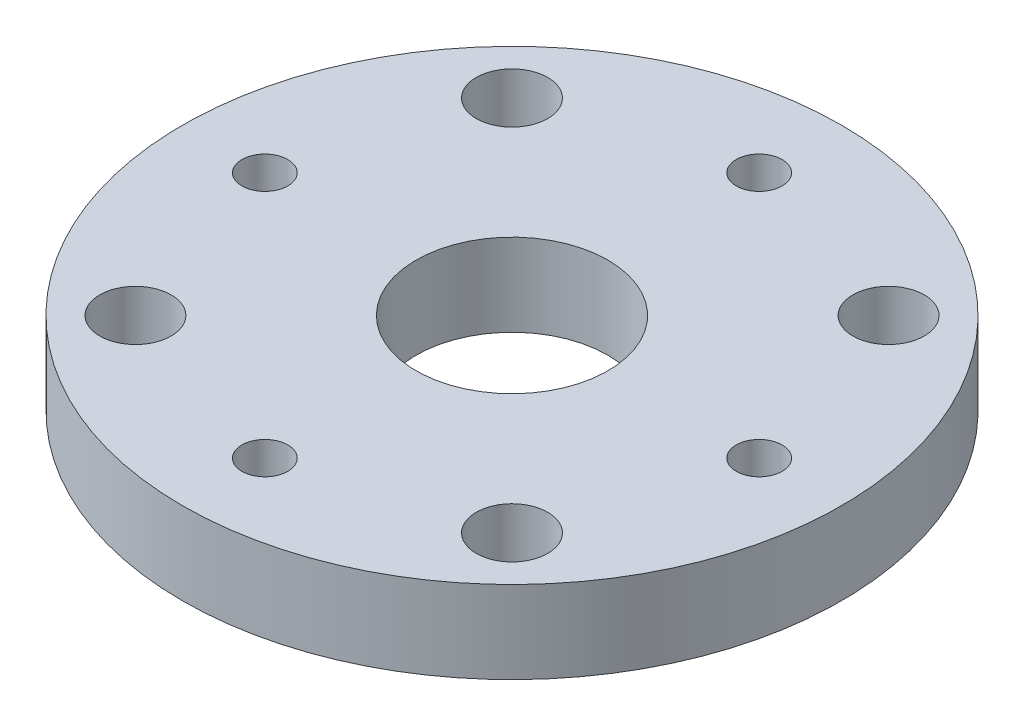
ISO-10303-21;
HEADER;
FILE_DESCRIPTION(('STEP AP214'),'2;1');
FILE_NAME('part.step','',(''),(''),'','','');
FILE_SCHEMA(('AUTOMOTIVE_DESIGN { 1 0 10303 214 1 1 1 1 }'));
ENDSEC;
DATA;
#1=APPLICATION_CONTEXT('core data for automotive mechanical design processes');
#2=APPLICATION_PROTOCOL_DEFINITION('international standard','automotive_design',2000,#1);
#3=PRODUCT_CONTEXT('',#1,'mechanical');
#4=PRODUCT('Part','Part','',(#3));
#5=PRODUCT_RELATED_PRODUCT_CATEGORY('part','',(#4));
#6=PRODUCT_DEFINITION_FORMATION('','',#4);
#7=PRODUCT_DEFINITION_CONTEXT('part definition',#1,'design');
#8=PRODUCT_DEFINITION('design','',#6,#7);
#9=PRODUCT_DEFINITION_SHAPE('','',#8);
#10=(LENGTH_UNIT() NAMED_UNIT(*) SI_UNIT(.MILLI.,.METRE.));
#11=(NAMED_UNIT(*) PLANE_ANGLE_UNIT() SI_UNIT($,.RADIAN.));
#12=(NAMED_UNIT(*) SI_UNIT($,.STERADIAN.) SOLID_ANGLE_UNIT());
#13=UNCERTAINTY_MEASURE_WITH_UNIT(LENGTH_MEASURE(1.E-05),#10,'distance_accuracy_value','');
#14=(GEOMETRIC_REPRESENTATION_CONTEXT(3) GLOBAL_UNCERTAINTY_ASSIGNED_CONTEXT((#13)) GLOBAL_UNIT_ASSIGNED_CONTEXT((#10,
#11,#12)) REPRESENTATION_CONTEXT('',''));
#15=CARTESIAN_POINT('',(0.,0.,0.));
#16=DIRECTION('',(0.,0.,1.));
#17=DIRECTION('',(1.,0.,0.));
#18=AXIS2_PLACEMENT_3D('',#15,#16,#17);
#19=CARTESIAN_POINT('',(34.2805367519242,15.,-34.2805367519234));
#20=DIRECTION('',(0.,-1.,0.));
#21=DIRECTION('',(0.,0.,-1.));
#22=AXIS2_PLACEMENT_3D('',#19,#20,#21);
#23=CYLINDRICAL_SURFACE('',#22,2.74999999999969);
#24=CARTESIAN_POINT('',(34.2805367519242,0.,-34.2805367519234));
#25=DIRECTION('',(0.,-1.,0.));
#26=DIRECTION('',(0.,0.,-1.));
#27=AXIS2_PLACEMENT_3D('',#24,#25,#26);
#28=CIRCLE('',#27,2.74999999999969);
#29=CARTESIAN_POINT('',(34.2805367519242,0.,-37.0305367519231));
#30=VERTEX_POINT('',#29);
#31=EDGE_CURVE('E82',#30,#30,#28,.T.);
#32=ORIENTED_EDGE('',*,*,#31,.T.);
#33=EDGE_LOOP('',(#32));
#34=FACE_BOUND('',#33,.T.);
#35=CARTESIAN_POINT('',(34.2805367519242,5.,-34.2805367519234));
#36=DIRECTION('',(0.,1.,0.));
#37=DIRECTION('',(0.,0.,1.));
#38=AXIS2_PLACEMENT_3D('',#35,#36,#37);
#39=CIRCLE('',#38,2.74999999999969);
#40=CARTESIAN_POINT('',(34.2805367519242,5.,-31.5305367519237));
#41=VERTEX_POINT('',#40);
#42=EDGE_CURVE('E40',#41,#41,#39,.F.);
#43=ORIENTED_EDGE('',*,*,#42,.F.);
#44=EDGE_LOOP('',(#43));
#45=FACE_BOUND('',#44,.T.);
#46=ADVANCED_FACE('F36',(#34,#45),#23,.F.);
#47=CARTESIAN_POINT('',(-34.2805367519234,15.,-34.2805367519243));
#48=DIRECTION('',(0.,-1.,0.));
#49=DIRECTION('',(0.,0.,-1.));
#50=AXIS2_PLACEMENT_3D('',#47,#48,#49);
#51=CYLINDRICAL_SURFACE('',#50,2.74999999999999);
#52=CARTESIAN_POINT('',(-34.2805367519234,0.,-34.2805367519243));
#53=DIRECTION('',(0.,-1.,0.));
#54=DIRECTION('',(0.,0.,-1.));
#55=AXIS2_PLACEMENT_3D('',#52,#53,#54);
#56=CIRCLE('',#55,2.74999999999999);
#57=CARTESIAN_POINT('',(-34.2805367519234,0.,-37.0305367519242));
#58=VERTEX_POINT('',#57);
#59=EDGE_CURVE('E79',#58,#58,#56,.T.);
#60=ORIENTED_EDGE('',*,*,#59,.T.);
#61=EDGE_LOOP('',(#60));
#62=FACE_BOUND('',#61,.T.);
#63=CARTESIAN_POINT('',(-34.2805367519234,5.,-34.2805367519243));
#64=DIRECTION('',(0.,1.,0.));
#65=DIRECTION('',(0.,0.,1.));
#66=AXIS2_PLACEMENT_3D('',#63,#64,#65);
#67=CIRCLE('',#66,2.74999999999999);
#68=CARTESIAN_POINT('',(-34.2805367519234,5.,-31.5305367519243));
#69=VERTEX_POINT('',#68);
#70=EDGE_CURVE('E61',#69,#69,#67,.F.);
#71=ORIENTED_EDGE('',*,*,#70,.F.);
#72=EDGE_LOOP('',(#71));
#73=FACE_BOUND('',#72,.T.);
#74=ADVANCED_FACE('F131',(#62,#73),#51,.F.);
#75=CARTESIAN_POINT('',(-34.2805367519242,15.,34.2805367519234));
#76=DIRECTION('',(0.,-1.,0.));
#77=DIRECTION('',(0.,0.,-1.));
#78=AXIS2_PLACEMENT_3D('',#75,#76,#77);
#79=CYLINDRICAL_SURFACE('',#78,2.75);
#80=CARTESIAN_POINT('',(-34.2805367519242,0.,34.2805367519234));
#81=DIRECTION('',(0.,-1.,0.));
#82=DIRECTION('',(0.,0.,-1.));
#83=AXIS2_PLACEMENT_3D('',#80,#81,#82);
#84=CIRCLE('',#83,2.75);
#85=CARTESIAN_POINT('',(-34.2805367519242,0.,31.5305367519234));
#86=VERTEX_POINT('',#85);
#87=EDGE_CURVE('E83',#86,#86,#84,.T.);
#88=ORIENTED_EDGE('',*,*,#87,.T.);
#89=EDGE_LOOP('',(#88));
#90=FACE_BOUND('',#89,.T.);
#91=CARTESIAN_POINT('',(-34.2805367519242,5.,34.2805367519234));
#92=DIRECTION('',(0.,1.,0.));
#93=DIRECTION('',(0.,0.,1.));
#94=AXIS2_PLACEMENT_3D('',#91,#92,#93);
#95=CIRCLE('',#94,2.75);
#96=CARTESIAN_POINT('',(-34.2805367519242,5.,37.0305367519234));
#97=VERTEX_POINT('',#96);
#98=EDGE_CURVE('E58',#97,#97,#95,.F.);
#99=ORIENTED_EDGE('',*,*,#98,.F.);
#100=EDGE_LOOP('',(#99));
#101=FACE_BOUND('',#100,.T.);
#102=ADVANCED_FACE('F137',(#90,#101),#79,.F.);
#103=CARTESIAN_POINT('',(34.2805367519234,15.,34.2805367519243));
#104=DIRECTION('',(0.,-1.,0.));
#105=DIRECTION('',(0.,0.,-1.));
#106=AXIS2_PLACEMENT_3D('',#103,#104,#105);
#107=CYLINDRICAL_SURFACE('',#106,2.75);
#108=CARTESIAN_POINT('',(34.2805367519234,0.,34.2805367519243));
#109=DIRECTION('',(0.,-1.,0.));
#110=DIRECTION('',(0.,0.,-1.));
#111=AXIS2_PLACEMENT_3D('',#108,#109,#110);
#112=CIRCLE('',#111,2.75);
#113=CARTESIAN_POINT('',(34.2805367519234,0.,31.5305367519243));
#114=VERTEX_POINT('',#113);
#115=EDGE_CURVE('E75',#114,#114,#112,.T.);
#116=ORIENTED_EDGE('',*,*,#115,.T.);
#117=EDGE_LOOP('',(#116));
#118=FACE_BOUND('',#117,.T.);
#119=CARTESIAN_POINT('',(34.2805367519234,5.,34.2805367519243));
#120=DIRECTION('',(0.,1.,0.));
#121=DIRECTION('',(0.,0.,1.));
#122=AXIS2_PLACEMENT_3D('',#119,#120,#121);
#123=CIRCLE('',#122,2.75);
#124=CARTESIAN_POINT('',(34.2805367519234,5.,37.0305367519243));
#125=VERTEX_POINT('',#124);
#126=EDGE_CURVE('E55',#125,#125,#123,.F.);
#127=ORIENTED_EDGE('',*,*,#126,.F.);
#128=EDGE_LOOP('',(#127));
#129=FACE_BOUND('',#128,.T.);
#130=ADVANCED_FACE('F125',(#118,#129),#107,.F.);
#131=CARTESIAN_POINT('',(0.,15.,0.));
#132=DIRECTION('',(0.,-1.,0.));
#133=DIRECTION('',(0.,0.,-1.));
#134=AXIS2_PLACEMENT_3D('',#131,#132,#133);
#135=CYLINDRICAL_SURFACE('',#134,60.);
#136=CARTESIAN_POINT('',(0.,15.,0.));
#137=DIRECTION('',(0.,1.,0.));
#138=DIRECTION('',(0.,0.,1.));
#139=AXIS2_PLACEMENT_3D('',#136,#137,#138);
#140=CIRCLE('',#139,60.);
#141=CARTESIAN_POINT('',(0.,15.,60.));
#142=VERTEX_POINT('',#141);
#143=EDGE_CURVE('E11',#142,#142,#140,.T.);
#144=ORIENTED_EDGE('',*,*,#143,.F.);
#145=EDGE_LOOP('',(#144));
#146=FACE_BOUND('',#145,.T.);
#147=CARTESIAN_POINT('',(0.,0.,0.));
#148=DIRECTION('',(0.,1.,0.));
#149=DIRECTION('',(0.,0.,1.));
#150=AXIS2_PLACEMENT_3D('',#147,#148,#149);
#151=CIRCLE('',#150,60.);
#152=CARTESIAN_POINT('',(0.,0.,60.));
#153=VERTEX_POINT('',#152);
#154=EDGE_CURVE('E44',#153,#153,#151,.T.);
#155=ORIENTED_EDGE('',*,*,#154,.T.);
#156=EDGE_LOOP('',(#155));
#157=FACE_BOUND('',#156,.T.);
#158=ADVANCED_FACE('F38',(#146,#157),#135,.T.);
#159=CARTESIAN_POINT('',(0.,15.,0.));
#160=DIRECTION('',(0.,1.,0.));
#161=DIRECTION('',(0.,0.,1.));
#162=AXIS2_PLACEMENT_3D('',#159,#160,#161);
#163=PLANE('',#162);
#164=CARTESIAN_POINT('',(-34.2805367519242,15.,34.2805367519234));
#165=DIRECTION('',(0.,1.,0.));
#166=DIRECTION('',(0.,0.,1.));
#167=AXIS2_PLACEMENT_3D('',#164,#165,#166);
#168=CIRCLE('',#167,6.50000000000046);
#169=CARTESIAN_POINT('',(-34.2805367519242,15.,40.7805367519238));
#170=VERTEX_POINT('',#169);
#171=EDGE_CURVE('E389',#170,#170,#168,.T.);
#172=ORIENTED_EDGE('',*,*,#171,.F.);
#173=EDGE_LOOP('',(#172));
#174=FACE_BOUND('',#173,.T.);
#175=CARTESIAN_POINT('',(34.2805367519234,15.,34.2805367519242));
#176=DIRECTION('',(0.,1.,0.));
#177=DIRECTION('',(0.,0.,1.));
#178=AXIS2_PLACEMENT_3D('',#175,#176,#177);
#179=CIRCLE('',#178,6.5000000000003);
#180=CARTESIAN_POINT('',(34.2805367519234,15.,40.7805367519246));
#181=VERTEX_POINT('',#180);
#182=EDGE_CURVE('E383',#181,#181,#179,.T.);
#183=ORIENTED_EDGE('',*,*,#182,.F.);
#184=EDGE_LOOP('',(#183));
#185=FACE_BOUND('',#184,.T.);
#186=CARTESIAN_POINT('',(34.2805367519243,15.,-34.2805367519234));
#187=DIRECTION('',(0.,1.,0.));
#188=DIRECTION('',(0.,0.,1.));
#189=AXIS2_PLACEMENT_3D('',#186,#187,#188);
#190=CIRCLE('',#189,6.50000000000015);
#191=CARTESIAN_POINT('',(34.2805367519243,15.,-27.7805367519232));
#192=VERTEX_POINT('',#191);
#193=EDGE_CURVE('E376',#192,#192,#190,.T.);
#194=ORIENTED_EDGE('',*,*,#193,.F.);
#195=EDGE_LOOP('',(#194));
#196=FACE_BOUND('',#195,.T.);
#197=CARTESIAN_POINT('',(-34.2805367519234,15.,-34.2805367519243));
#198=DIRECTION('',(0.,1.,0.));
#199=DIRECTION('',(0.,0.,1.));
#200=AXIS2_PLACEMENT_3D('',#197,#198,#199);
#201=CIRCLE('',#200,6.5);
#202=CARTESIAN_POINT('',(-34.2805367519234,15.,-27.7805367519243));
#203=VERTEX_POINT('',#202);
#204=EDGE_CURVE('E380',#203,#203,#201,.T.);
#205=ORIENTED_EDGE('',*,*,#204,.F.);
#206=EDGE_LOOP('',(#205));
#207=FACE_BOUND('',#206,.T.);
#208=CARTESIAN_POINT('',(0.,15.,0.));
#209=DIRECTION('',(0.,-1.,0.));
#210=DIRECTION('',(0.,0.,-1.));
#211=AXIS2_PLACEMENT_3D('',#208,#209,#210);
#212=CIRCLE('',#211,17.4625);
#213=CARTESIAN_POINT('',(0.,15.,-17.4625));
#214=VERTEX_POINT('',#213);
#215=EDGE_CURVE('E70',#214,#214,#212,.T.);
#216=ORIENTED_EDGE('',*,*,#215,.T.);
#217=EDGE_LOOP('',(#216));
#218=FACE_BOUND('',#217,.T.);
#219=CARTESIAN_POINT('',(45.,15.,0.));
#220=DIRECTION('',(0.,1.,0.));
#221=DIRECTION('',(0.,0.,1.));
#222=AXIS2_PLACEMENT_3D('',#219,#220,#221);
#223=CIRCLE('',#222,4.175);
#224=CARTESIAN_POINT('',(45.,15.,4.175));
#225=VERTEX_POINT('',#224);
#226=EDGE_CURVE('E92',#225,#225,#223,.T.);
#227=ORIENTED_EDGE('',*,*,#226,.F.);
#228=EDGE_LOOP('',(#227));
#229=FACE_BOUND('',#228,.T.);
#230=CARTESIAN_POINT('',(0.,15.,45.));
#231=DIRECTION('',(0.,1.,0.));
#232=DIRECTION('',(0.,0.,1.));
#233=AXIS2_PLACEMENT_3D('',#230,#231,#232);
#234=CIRCLE('',#233,4.175);
#235=CARTESIAN_POINT('',(0.,15.,49.175));
#236=VERTEX_POINT('',#235);
#237=EDGE_CURVE('E98',#236,#236,#234,.T.);
#238=ORIENTED_EDGE('',*,*,#237,.F.);
#239=EDGE_LOOP('',(#238));
#240=FACE_BOUND('',#239,.T.);
#241=CARTESIAN_POINT('',(-45.,15.,-3.14233320495882E-13));
#242=DIRECTION('',(0.,1.,0.));
#243=DIRECTION('',(0.,0.,1.));
#244=AXIS2_PLACEMENT_3D('',#241,#242,#243);
#245=CIRCLE('',#244,4.175);
#246=CARTESIAN_POINT('',(-45.,15.,4.17499999999968));
#247=VERTEX_POINT('',#246);
#248=EDGE_CURVE('E104',#247,#247,#245,.T.);
#249=ORIENTED_EDGE('',*,*,#248,.F.);
#250=EDGE_LOOP('',(#249));
#251=FACE_BOUND('',#250,.T.);
#252=CARTESIAN_POINT('',(0.,15.,-45.));
#253=DIRECTION('',(0.,1.,0.));
#254=DIRECTION('',(0.,0.,1.));
#255=AXIS2_PLACEMENT_3D('',#252,#253,#254);
#256=CIRCLE('',#255,4.175);
#257=CARTESIAN_POINT('',(0.,15.,-40.825));
#258=VERTEX_POINT('',#257);
#259=EDGE_CURVE('E52',#258,#258,#256,.T.);
#260=ORIENTED_EDGE('',*,*,#259,.F.);
#261=EDGE_LOOP('',(#260));
#262=FACE_BOUND('',#261,.T.);
#263=ORIENTED_EDGE('',*,*,#143,.T.);
#264=EDGE_LOOP('',(#263));
#265=FACE_BOUND('',#264,.T.);
#266=ADVANCED_FACE('F115',(#174,#185,#196,#207,#218,#229,#240,#251,#262,#265),#163,.T.);
#267=CARTESIAN_POINT('',(0.,0.,0.));
#268=DIRECTION('',(0.,1.,0.));
#269=DIRECTION('',(0.,0.,1.));
#270=AXIS2_PLACEMENT_3D('',#267,#268,#269);
#271=PLANE('',#270);
#272=CARTESIAN_POINT('',(0.,0.,0.));
#273=DIRECTION('',(0.,-1.,0.));
#274=DIRECTION('',(0.,0.,-1.));
#275=AXIS2_PLACEMENT_3D('',#272,#273,#274);
#276=CIRCLE('',#275,17.4625);
#277=CARTESIAN_POINT('',(0.,0.,-17.4625));
#278=VERTEX_POINT('',#277);
#279=EDGE_CURVE('E66',#278,#278,#276,.T.);
#280=ORIENTED_EDGE('',*,*,#279,.F.);
#281=EDGE_LOOP('',(#280));
#282=FACE_BOUND('',#281,.T.);
#283=ORIENTED_EDGE('',*,*,#115,.F.);
#284=EDGE_LOOP('',(#283));
#285=FACE_BOUND('',#284,.T.);
#286=ORIENTED_EDGE('',*,*,#87,.F.);
#287=EDGE_LOOP('',(#286));
#288=FACE_BOUND('',#287,.T.);
#289=ORIENTED_EDGE('',*,*,#59,.F.);
#290=EDGE_LOOP('',(#289));
#291=FACE_BOUND('',#290,.T.);
#292=ORIENTED_EDGE('',*,*,#31,.F.);
#293=EDGE_LOOP('',(#292));
#294=FACE_BOUND('',#293,.T.);
#295=ORIENTED_EDGE('',*,*,#154,.F.);
#296=EDGE_LOOP('',(#295));
#297=FACE_BOUND('',#296,.T.);
#298=ADVANCED_FACE('F117',(#282,#285,#288,#291,#294,#297),#271,.F.);
#299=CARTESIAN_POINT('',(0.,5.,-45.));
#300=DIRECTION('',(0.,1.,0.));
#301=DIRECTION('',(0.,0.,1.));
#302=AXIS2_PLACEMENT_3D('',#299,#300,#301);
#303=CYLINDRICAL_SURFACE('',#302,4.175);
#304=CARTESIAN_POINT('',(0.,5.,-45.));
#305=DIRECTION('',(0.,1.,0.));
#306=DIRECTION('',(0.,0.,1.));
#307=AXIS2_PLACEMENT_3D('',#304,#305,#306);
#308=CIRCLE('',#307,4.175);
#309=CARTESIAN_POINT('',(0.,5.,-40.825));
#310=VERTEX_POINT('',#309);
#311=EDGE_CURVE('E106',#310,#310,#308,.T.);
#312=ORIENTED_EDGE('',*,*,#311,.F.);
#313=EDGE_LOOP('',(#312));
#314=FACE_BOUND('',#313,.T.);
#315=ORIENTED_EDGE('',*,*,#259,.T.);
#316=EDGE_LOOP('',(#315));
#317=FACE_BOUND('',#316,.T.);
#318=ADVANCED_FACE('F113',(#314,#317),#303,.F.);
#319=CARTESIAN_POINT('',(0.,5.,-45.));
#320=DIRECTION('',(0.,1.,0.));
#321=DIRECTION('',(0.,0.,1.));
#322=AXIS2_PLACEMENT_3D('',#319,#320,#321);
#323=PLANE('',#322);
#324=ORIENTED_EDGE('',*,*,#311,.T.);
#325=EDGE_LOOP('',(#324));
#326=FACE_BOUND('',#325,.T.);
#327=ADVANCED_FACE('F168',(#326),#323,.T.);
#328=CARTESIAN_POINT('',(-45.,5.,-3.14233320495882E-13));
#329=DIRECTION('',(0.,1.,0.));
#330=DIRECTION('',(0.,0.,1.));
#331=AXIS2_PLACEMENT_3D('',#328,#329,#330);
#332=CYLINDRICAL_SURFACE('',#331,4.175);
#333=CARTESIAN_POINT('',(-45.,5.,-3.14233320495882E-13));
#334=DIRECTION('',(0.,1.,0.));
#335=DIRECTION('',(0.,0.,1.));
#336=AXIS2_PLACEMENT_3D('',#333,#334,#335);
#337=CIRCLE('',#336,4.175);
#338=CARTESIAN_POINT('',(-45.,5.,4.17499999999968));
#339=VERTEX_POINT('',#338);
#340=EDGE_CURVE('E101',#339,#339,#337,.T.);
#341=ORIENTED_EDGE('',*,*,#340,.F.);
#342=EDGE_LOOP('',(#341));
#343=FACE_BOUND('',#342,.T.);
#344=ORIENTED_EDGE('',*,*,#248,.T.);
#345=EDGE_LOOP('',(#344));
#346=FACE_BOUND('',#345,.T.);
#347=ADVANCED_FACE('F164',(#343,#346),#332,.F.);
#348=CARTESIAN_POINT('',(-45.,5.,-3.14233320495882E-13));
#349=DIRECTION('',(0.,1.,0.));
#350=DIRECTION('',(0.,0.,1.));
#351=AXIS2_PLACEMENT_3D('',#348,#349,#350);
#352=PLANE('',#351);
#353=ORIENTED_EDGE('',*,*,#340,.T.);
#354=EDGE_LOOP('',(#353));
#355=FACE_BOUND('',#354,.T.);
#356=ADVANCED_FACE('F160',(#355),#352,.T.);
#357=CARTESIAN_POINT('',(0.,5.,45.));
#358=DIRECTION('',(0.,1.,0.));
#359=DIRECTION('',(0.,0.,1.));
#360=AXIS2_PLACEMENT_3D('',#357,#358,#359);
#361=CYLINDRICAL_SURFACE('',#360,4.175);
#362=CARTESIAN_POINT('',(0.,5.,45.));
#363=DIRECTION('',(0.,1.,0.));
#364=DIRECTION('',(0.,0.,1.));
#365=AXIS2_PLACEMENT_3D('',#362,#363,#364);
#366=CIRCLE('',#365,4.175);
#367=CARTESIAN_POINT('',(0.,5.,49.175));
#368=VERTEX_POINT('',#367);
#369=EDGE_CURVE('E95',#368,#368,#366,.T.);
#370=ORIENTED_EDGE('',*,*,#369,.F.);
#371=EDGE_LOOP('',(#370));
#372=FACE_BOUND('',#371,.T.);
#373=ORIENTED_EDGE('',*,*,#237,.T.);
#374=EDGE_LOOP('',(#373));
#375=FACE_BOUND('',#374,.T.);
#376=ADVANCED_FACE('F156',(#372,#375),#361,.F.);
#377=CARTESIAN_POINT('',(0.,5.,45.));
#378=DIRECTION('',(0.,1.,0.));
#379=DIRECTION('',(0.,0.,1.));
#380=AXIS2_PLACEMENT_3D('',#377,#378,#379);
#381=PLANE('',#380);
#382=ORIENTED_EDGE('',*,*,#369,.T.);
#383=EDGE_LOOP('',(#382));
#384=FACE_BOUND('',#383,.T.);
#385=ADVANCED_FACE('F152',(#384),#381,.T.);
#386=CARTESIAN_POINT('',(45.,5.,0.));
#387=DIRECTION('',(0.,1.,0.));
#388=DIRECTION('',(0.,0.,1.));
#389=AXIS2_PLACEMENT_3D('',#386,#387,#388);
#390=CYLINDRICAL_SURFACE('',#389,4.175);
#391=CARTESIAN_POINT('',(45.,5.,0.));
#392=DIRECTION('',(0.,1.,0.));
#393=DIRECTION('',(0.,0.,1.));
#394=AXIS2_PLACEMENT_3D('',#391,#392,#393);
#395=CIRCLE('',#394,4.175);
#396=CARTESIAN_POINT('',(45.,5.,4.175));
#397=VERTEX_POINT('',#396);
#398=EDGE_CURVE('E49',#397,#397,#395,.T.);
#399=ORIENTED_EDGE('',*,*,#398,.F.);
#400=EDGE_LOOP('',(#399));
#401=FACE_BOUND('',#400,.T.);
#402=ORIENTED_EDGE('',*,*,#226,.T.);
#403=EDGE_LOOP('',(#402));
#404=FACE_BOUND('',#403,.T.);
#405=ADVANCED_FACE('F148',(#401,#404),#390,.F.);
#406=CARTESIAN_POINT('',(45.,5.,0.));
#407=DIRECTION('',(0.,1.,0.));
#408=DIRECTION('',(0.,0.,1.));
#409=AXIS2_PLACEMENT_3D('',#406,#407,#408);
#410=PLANE('',#409);
#411=ORIENTED_EDGE('',*,*,#398,.T.);
#412=EDGE_LOOP('',(#411));
#413=FACE_BOUND('',#412,.T.);
#414=ADVANCED_FACE('F144',(#413),#410,.T.);
#415=CARTESIAN_POINT('',(0.,15.,0.));
#416=DIRECTION('',(0.,-1.,0.));
#417=DIRECTION('',(0.,0.,-1.));
#418=AXIS2_PLACEMENT_3D('',#415,#416,#417);
#419=CYLINDRICAL_SURFACE('',#418,17.4625);
#420=ORIENTED_EDGE('',*,*,#215,.F.);
#421=EDGE_LOOP('',(#420));
#422=FACE_BOUND('',#421,.T.);
#423=ORIENTED_EDGE('',*,*,#279,.T.);
#424=EDGE_LOOP('',(#423));
#425=FACE_BOUND('',#424,.T.);
#426=ADVANCED_FACE('F147',(#422,#425),#419,.F.);
#427=CARTESIAN_POINT('',(0.,5.,0.));
#428=DIRECTION('',(0.,1.,0.));
#429=DIRECTION('',(0.,0.,1.));
#430=AXIS2_PLACEMENT_3D('',#427,#428,#429);
#431=PLANE('',#430);
#432=CARTESIAN_POINT('',(34.2805367519234,5.,34.2805367519242));
#433=DIRECTION('',(0.,1.,0.));
#434=DIRECTION('',(0.,0.,1.));
#435=AXIS2_PLACEMENT_3D('',#432,#433,#434);
#436=CIRCLE('',#435,6.5000000000003);
#437=CARTESIAN_POINT('',(34.2805367519234,5.,40.7805367519246));
#438=VERTEX_POINT('',#437);
#439=EDGE_CURVE('E378',#438,#438,#436,.F.);
#440=ORIENTED_EDGE('',*,*,#439,.F.);
#441=EDGE_LOOP('',(#440));
#442=FACE_BOUND('',#441,.T.);
#443=ORIENTED_EDGE('',*,*,#126,.T.);
#444=EDGE_LOOP('',(#443));
#445=FACE_BOUND('',#444,.T.);
#446=ADVANCED_FACE('F212',(#442,#445),#431,.T.);
#447=CARTESIAN_POINT('',(34.2805367519234,-18.3847763108515,34.2805367519242));
#448=DIRECTION('',(0.,1.,0.));
#449=DIRECTION('',(0.,0.,1.));
#450=AXIS2_PLACEMENT_3D('',#447,#448,#449);
#451=CYLINDRICAL_SURFACE('',#450,6.5000000000003);
#452=ORIENTED_EDGE('',*,*,#439,.T.);
#453=EDGE_LOOP('',(#452));
#454=FACE_BOUND('',#453,.T.);
#455=ORIENTED_EDGE('',*,*,#182,.T.);
#456=EDGE_LOOP('',(#455));
#457=FACE_BOUND('',#456,.T.);
#458=ADVANCED_FACE('F220',(#454,#457),#451,.F.);
#459=CARTESIAN_POINT('',(0.,5.,0.));
#460=DIRECTION('',(0.,1.,0.));
#461=DIRECTION('',(0.,0.,1.));
#462=AXIS2_PLACEMENT_3D('',#459,#460,#461);
#463=PLANE('',#462);
#464=CARTESIAN_POINT('',(-34.2805367519242,5.,34.2805367519234));
#465=DIRECTION('',(0.,1.,0.));
#466=DIRECTION('',(0.,0.,1.));
#467=AXIS2_PLACEMENT_3D('',#464,#465,#466);
#468=CIRCLE('',#467,6.50000000000046);
#469=CARTESIAN_POINT('',(-34.2805367519242,5.,40.7805367519238));
#470=VERTEX_POINT('',#469);
#471=EDGE_CURVE('E387',#470,#470,#468,.F.);
#472=ORIENTED_EDGE('',*,*,#471,.F.);
#473=EDGE_LOOP('',(#472));
#474=FACE_BOUND('',#473,.T.);
#475=ORIENTED_EDGE('',*,*,#98,.T.);
#476=EDGE_LOOP('',(#475));
#477=FACE_BOUND('',#476,.T.);
#478=ADVANCED_FACE('F228',(#474,#477),#463,.T.);
#479=CARTESIAN_POINT('',(-34.2805367519242,-18.3847763108515,34.2805367519234));
#480=DIRECTION('',(0.,1.,0.));
#481=DIRECTION('',(0.,0.,1.));
#482=AXIS2_PLACEMENT_3D('',#479,#480,#481);
#483=CYLINDRICAL_SURFACE('',#482,6.50000000000046);
#484=ORIENTED_EDGE('',*,*,#471,.T.);
#485=EDGE_LOOP('',(#484));
#486=FACE_BOUND('',#485,.T.);
#487=ORIENTED_EDGE('',*,*,#171,.T.);
#488=EDGE_LOOP('',(#487));
#489=FACE_BOUND('',#488,.T.);
#490=ADVANCED_FACE('F236',(#486,#489),#483,.F.);
#491=CARTESIAN_POINT('',(0.,5.,0.));
#492=DIRECTION('',(0.,1.,0.));
#493=DIRECTION('',(0.,0.,1.));
#494=AXIS2_PLACEMENT_3D('',#491,#492,#493);
#495=PLANE('',#494);
#496=CARTESIAN_POINT('',(-34.2805367519234,5.,-34.2805367519243));
#497=DIRECTION('',(0.,1.,0.));
#498=DIRECTION('',(0.,0.,1.));
#499=AXIS2_PLACEMENT_3D('',#496,#497,#498);
#500=CIRCLE('',#499,6.5);
#501=CARTESIAN_POINT('',(-34.2805367519234,5.,-27.7805367519243));
#502=VERTEX_POINT('',#501);
#503=EDGE_CURVE('E59',#502,#502,#500,.F.);
#504=ORIENTED_EDGE('',*,*,#503,.F.);
#505=EDGE_LOOP('',(#504));
#506=FACE_BOUND('',#505,.T.);
#507=ORIENTED_EDGE('',*,*,#70,.T.);
#508=EDGE_LOOP('',(#507));
#509=FACE_BOUND('',#508,.T.);
#510=ADVANCED_FACE('F244',(#506,#509),#495,.T.);
#511=CARTESIAN_POINT('',(-34.2805367519234,-18.3847763108515,-34.2805367519243));
#512=DIRECTION('',(0.,1.,0.));
#513=DIRECTION('',(0.,0.,1.));
#514=AXIS2_PLACEMENT_3D('',#511,#512,#513);
#515=CYLINDRICAL_SURFACE('',#514,6.5);
#516=ORIENTED_EDGE('',*,*,#503,.T.);
#517=EDGE_LOOP('',(#516));
#518=FACE_BOUND('',#517,.T.);
#519=ORIENTED_EDGE('',*,*,#204,.T.);
#520=EDGE_LOOP('',(#519));
#521=FACE_BOUND('',#520,.T.);
#522=ADVANCED_FACE('F252',(#518,#521),#515,.F.);
#523=CARTESIAN_POINT('',(0.,5.,0.));
#524=DIRECTION('',(0.,1.,0.));
#525=DIRECTION('',(0.,0.,1.));
#526=AXIS2_PLACEMENT_3D('',#523,#524,#525);
#527=PLANE('',#526);
#528=CARTESIAN_POINT('',(34.2805367519243,5.,-34.2805367519234));
#529=DIRECTION('',(0.,1.,0.));
#530=DIRECTION('',(0.,0.,1.));
#531=AXIS2_PLACEMENT_3D('',#528,#529,#530);
#532=CIRCLE('',#531,6.50000000000015);
#533=CARTESIAN_POINT('',(34.2805367519243,5.,-27.7805367519232));
#534=VERTEX_POINT('',#533);
#535=EDGE_CURVE('E373',#534,#534,#532,.F.);
#536=ORIENTED_EDGE('',*,*,#535,.F.);
#537=EDGE_LOOP('',(#536));
#538=FACE_BOUND('',#537,.T.);
#539=ORIENTED_EDGE('',*,*,#42,.T.);
#540=EDGE_LOOP('',(#539));
#541=FACE_BOUND('',#540,.T.);
#542=ADVANCED_FACE('F260',(#538,#541),#527,.T.);
#543=CARTESIAN_POINT('',(34.2805367519243,-18.3847763108515,-34.2805367519234));
#544=DIRECTION('',(0.,1.,0.));
#545=DIRECTION('',(0.,0.,1.));
#546=AXIS2_PLACEMENT_3D('',#543,#544,#545);
#547=CYLINDRICAL_SURFACE('',#546,6.50000000000015);
#548=ORIENTED_EDGE('',*,*,#535,.T.);
#549=EDGE_LOOP('',(#548));
#550=FACE_BOUND('',#549,.T.);
#551=ORIENTED_EDGE('',*,*,#193,.T.);
#552=EDGE_LOOP('',(#551));
#553=FACE_BOUND('',#552,.T.);
#554=ADVANCED_FACE('F268',(#550,#553),#547,.F.);
#555=CLOSED_SHELL('',(#46,#74,#102,#130,#158,#266,#298,#318,#327,#347,#356,#376,#385,#405,#414,
#426,#446,#458,#478,#490,#510,#522,#542,#554));
#556=MANIFOLD_SOLID_BREP('B2',#555);
#557=ADVANCED_BREP_SHAPE_REPRESENTATION('',(#18,#556),#14);
#558=SHAPE_DEFINITION_REPRESENTATION(#9,#557);
ENDSEC;
END-ISO-10303-21;
